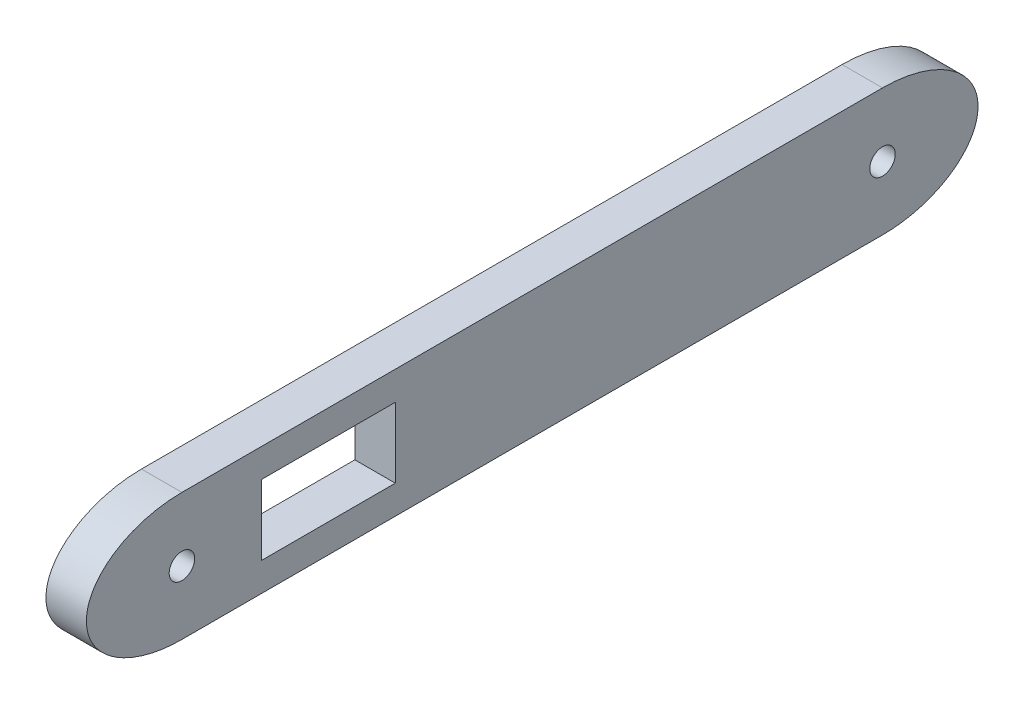
ISO-10303-21;
HEADER;
FILE_DESCRIPTION(('STEP AP214'),'2;1');
FILE_NAME('part.step','',(''),(''),'','','');
FILE_SCHEMA(('AUTOMOTIVE_DESIGN { 1 0 10303 214 1 1 1 1 }'));
ENDSEC;
DATA;
#1=APPLICATION_CONTEXT('core data for automotive mechanical design processes');
#2=APPLICATION_PROTOCOL_DEFINITION('international standard','automotive_design',2000,#1);
#3=PRODUCT_CONTEXT('',#1,'mechanical');
#4=PRODUCT('Part','Part','',(#3));
#5=PRODUCT_RELATED_PRODUCT_CATEGORY('part','',(#4));
#6=PRODUCT_DEFINITION_FORMATION('','',#4);
#7=PRODUCT_DEFINITION_CONTEXT('part definition',#1,'design');
#8=PRODUCT_DEFINITION('design','',#6,#7);
#9=PRODUCT_DEFINITION_SHAPE('','',#8);
#10=(LENGTH_UNIT() NAMED_UNIT(*) SI_UNIT(.MILLI.,.METRE.));
#11=(NAMED_UNIT(*) PLANE_ANGLE_UNIT() SI_UNIT($,.RADIAN.));
#12=(NAMED_UNIT(*) SI_UNIT($,.STERADIAN.) SOLID_ANGLE_UNIT());
#13=UNCERTAINTY_MEASURE_WITH_UNIT(LENGTH_MEASURE(1.E-05),#10,'distance_accuracy_value','');
#14=(GEOMETRIC_REPRESENTATION_CONTEXT(3) GLOBAL_UNCERTAINTY_ASSIGNED_CONTEXT((#13)) GLOBAL_UNIT_ASSIGNED_CONTEXT((#10,
#11,#12)) REPRESENTATION_CONTEXT('',''));
#15=CARTESIAN_POINT('',(0.,0.,0.));
#16=DIRECTION('',(0.,0.,1.));
#17=DIRECTION('',(1.,0.,0.));
#18=AXIS2_PLACEMENT_3D('',#15,#16,#17);
#19=CARTESIAN_POINT('',(12.7,0.,-110.));
#20=DIRECTION('',(-1.,0.,0.));
#21=DIRECTION('',(0.,0.,-1.));
#22=AXIS2_PLACEMENT_3D('',#19,#20,#21);
#23=ELLIPSE('',#22,30.,20.);
#24=DIRECTION('',(-1.,0.,0.));
#25=VECTOR('',#24,1.);
#26=SURFACE_OF_LINEAR_EXTRUSION('',#23,#25);
#27=CARTESIAN_POINT('',(0.,0.,-110.));
#28=DIRECTION('',(-1.,0.,0.));
#29=DIRECTION('',(0.,0.,-1.));
#30=AXIS2_PLACEMENT_3D('',#27,#28,#29);
#31=ELLIPSE('',#30,30.,20.);
#32=CARTESIAN_POINT('',(0.,20.,-110.));
#33=VERTEX_POINT('',#32);
#34=CARTESIAN_POINT('',(0.,-19.9999999999999,-110.));
#35=VERTEX_POINT('',#34);
#36=EDGE_CURVE('E214',#33,#35,#31,.T.);
#37=ORIENTED_EDGE('',*,*,#36,.F.);
#38=DIRECTION('',(-1.,0.,0.));
#39=VECTOR('',#38,1.);
#40=CARTESIAN_POINT('',(12.7,20.,-110.));
#41=LINE('',#40,#39);
#42=CARTESIAN_POINT('',(12.7,20.,-110.));
#43=VERTEX_POINT('',#42);
#44=EDGE_CURVE('E72',#43,#33,#41,.T.);
#45=ORIENTED_EDGE('',*,*,#44,.F.);
#46=CARTESIAN_POINT('',(12.7,-19.9999999999999,-110.));
#47=VERTEX_POINT('',#46);
#48=EDGE_CURVE('E178',#43,#47,#23,.T.);
#49=ORIENTED_EDGE('',*,*,#48,.T.);
#50=DIRECTION('',(-1.,0.,0.));
#51=VECTOR('',#50,1.);
#52=CARTESIAN_POINT('',(12.7,-19.9999999999999,-110.));
#53=LINE('',#52,#51);
#54=EDGE_CURVE('E12',#47,#35,#53,.T.);
#55=ORIENTED_EDGE('',*,*,#54,.T.);
#56=EDGE_LOOP('',(#37,#45,#49,#55));
#57=FACE_BOUND('',#56,.T.);
#58=ADVANCED_FACE('F62',(#57),#26,.T.);
#59=CARTESIAN_POINT('',(12.7,20.,0.));
#60=DIRECTION('',(0.,1.,0.));
#61=DIRECTION('',(0.,0.,1.));
#62=AXIS2_PLACEMENT_3D('',#59,#60,#61);
#63=PLANE('',#62);
#64=DIRECTION('',(0.,0.,-1.));
#65=VECTOR('',#64,1.);
#66=CARTESIAN_POINT('',(0.,20.,0.));
#67=LINE('',#66,#65);
#68=CARTESIAN_POINT('',(0.,20.,110.));
#69=VERTEX_POINT('',#68);
#70=EDGE_CURVE('E179',#69,#33,#67,.T.);
#71=ORIENTED_EDGE('',*,*,#70,.F.);
#72=DIRECTION('',(-1.,0.,0.));
#73=VECTOR('',#72,1.);
#74=CARTESIAN_POINT('',(12.7,20.,110.));
#75=LINE('',#74,#73);
#76=CARTESIAN_POINT('',(12.7,20.,110.));
#77=VERTEX_POINT('',#76);
#78=EDGE_CURVE('E226',#77,#69,#75,.T.);
#79=ORIENTED_EDGE('',*,*,#78,.F.);
#80=DIRECTION('',(0.,0.,-1.));
#81=VECTOR('',#80,1.);
#82=CARTESIAN_POINT('',(12.7,20.,0.));
#83=LINE('',#82,#81);
#84=EDGE_CURVE('E184',#77,#43,#83,.T.);
#85=ORIENTED_EDGE('',*,*,#84,.T.);
#86=ORIENTED_EDGE('',*,*,#44,.T.);
#87=EDGE_LOOP('',(#71,#79,#85,#86));
#88=FACE_BOUND('',#87,.T.);
#89=ADVANCED_FACE('F189',(#88),#63,.T.);
#90=CARTESIAN_POINT('',(12.7,-20.,0.));
#91=DIRECTION('',(0.,1.,0.));
#92=DIRECTION('',(0.,0.,1.));
#93=AXIS2_PLACEMENT_3D('',#90,#91,#92);
#94=PLANE('',#93);
#95=DIRECTION('',(0.,0.,-1.));
#96=VECTOR('',#95,1.);
#97=CARTESIAN_POINT('',(0.,-20.,0.));
#98=LINE('',#97,#96);
#99=CARTESIAN_POINT('',(0.,-20.,110.));
#100=VERTEX_POINT('',#99);
#101=EDGE_CURVE('E206',#100,#35,#98,.T.);
#102=ORIENTED_EDGE('',*,*,#101,.T.);
#103=ORIENTED_EDGE('',*,*,#54,.F.);
#104=DIRECTION('',(0.,0.,-1.));
#105=VECTOR('',#104,1.);
#106=CARTESIAN_POINT('',(12.7,-20.,0.));
#107=LINE('',#106,#105);
#108=CARTESIAN_POINT('',(12.7,-20.,110.));
#109=VERTEX_POINT('',#108);
#110=EDGE_CURVE('E175',#109,#47,#107,.T.);
#111=ORIENTED_EDGE('',*,*,#110,.F.);
#112=DIRECTION('',(-1.,0.,0.));
#113=VECTOR('',#112,1.);
#114=CARTESIAN_POINT('',(12.7,-20.,110.));
#115=LINE('',#114,#113);
#116=EDGE_CURVE('E209',#109,#100,#115,.T.);
#117=ORIENTED_EDGE('',*,*,#116,.T.);
#118=EDGE_LOOP('',(#102,#103,#111,#117));
#119=FACE_BOUND('',#118,.T.);
#120=ADVANCED_FACE('F192',(#119),#94,.F.);
#121=CARTESIAN_POINT('',(0.,0.,0.));
#122=DIRECTION('',(1.,0.,0.));
#123=DIRECTION('',(0.,0.,-1.));
#124=AXIS2_PLACEMENT_3D('',#121,#122,#123);
#125=PLANE('',#124);
#126=CARTESIAN_POINT('',(0.,0.,110.));
#127=DIRECTION('',(1.,0.,0.));
#128=DIRECTION('',(0.,0.,-1.));
#129=AXIS2_PLACEMENT_3D('',#126,#127,#128);
#130=CIRCLE('',#129,4.00000000000001);
#131=CARTESIAN_POINT('',(0.,0.,106.));
#132=VERTEX_POINT('',#131);
#133=EDGE_CURVE('E236',#132,#132,#130,.T.);
#134=ORIENTED_EDGE('',*,*,#133,.T.);
#135=EDGE_LOOP('',(#134));
#136=FACE_BOUND('',#135,.T.);
#137=CARTESIAN_POINT('',(0.,0.,-110.));
#138=DIRECTION('',(1.,0.,0.));
#139=DIRECTION('',(0.,0.,1.));
#140=AXIS2_PLACEMENT_3D('',#137,#138,#139);
#141=CIRCLE('',#140,4.00000000000001);
#142=CARTESIAN_POINT('',(0.,0.,-106.));
#143=VERTEX_POINT('',#142);
#144=EDGE_CURVE('E153',#143,#143,#141,.T.);
#145=ORIENTED_EDGE('',*,*,#144,.T.);
#146=EDGE_LOOP('',(#145));
#147=FACE_BOUND('',#146,.T.);
#148=DIRECTION('',(0.,0.,-1.));
#149=VECTOR('',#148,1.);
#150=CARTESIAN_POINT('',(0.,-11.,85.));
#151=LINE('',#150,#149);
#152=CARTESIAN_POINT('',(0.,-11.,85.));
#153=VERTEX_POINT('',#152);
#154=CARTESIAN_POINT('',(0.,-11.,43.));
#155=VERTEX_POINT('',#154);
#156=EDGE_CURVE('E163',#153,#155,#151,.T.);
#157=ORIENTED_EDGE('',*,*,#156,.T.);
#158=DIRECTION('',(0.,1.,0.));
#159=VECTOR('',#158,1.);
#160=CARTESIAN_POINT('',(0.,11.,43.));
#161=LINE('',#160,#159);
#162=CARTESIAN_POINT('',(0.,11.,43.));
#163=VERTEX_POINT('',#162);
#164=EDGE_CURVE('E131',#155,#163,#161,.T.);
#165=ORIENTED_EDGE('',*,*,#164,.T.);
#166=DIRECTION('',(0.,0.,1.));
#167=VECTOR('',#166,1.);
#168=CARTESIAN_POINT('',(0.,11.,85.));
#169=LINE('',#168,#167);
#170=CARTESIAN_POINT('',(0.,11.,85.));
#171=VERTEX_POINT('',#170);
#172=EDGE_CURVE('E169',#163,#171,#169,.T.);
#173=ORIENTED_EDGE('',*,*,#172,.T.);
#174=DIRECTION('',(0.,-1.,0.));
#175=VECTOR('',#174,1.);
#176=CARTESIAN_POINT('',(0.,11.,85.));
#177=LINE('',#176,#175);
#178=EDGE_CURVE('E80',#171,#153,#177,.T.);
#179=ORIENTED_EDGE('',*,*,#178,.T.);
#180=EDGE_LOOP('',(#157,#165,#173,#179));
#181=FACE_BOUND('',#180,.T.);
#182=ORIENTED_EDGE('',*,*,#101,.F.);
#183=CARTESIAN_POINT('',(0.,0.,110.));
#184=DIRECTION('',(1.,0.,0.));
#185=DIRECTION('',(0.,0.,1.));
#186=AXIS2_PLACEMENT_3D('',#183,#184,#185);
#187=ELLIPSE('',#186,30.,20.);
#188=EDGE_CURVE('E67',#69,#100,#187,.T.);
#189=ORIENTED_EDGE('',*,*,#188,.F.);
#190=ORIENTED_EDGE('',*,*,#70,.T.);
#191=ORIENTED_EDGE('',*,*,#36,.T.);
#192=EDGE_LOOP('',(#182,#189,#190,#191));
#193=FACE_BOUND('',#192,.T.);
#194=ADVANCED_FACE('F194',(#136,#147,#181,#193),#125,.F.);
#195=CARTESIAN_POINT('',(12.7,0.,0.));
#196=DIRECTION('',(1.,0.,0.));
#197=DIRECTION('',(0.,0.,-1.));
#198=AXIS2_PLACEMENT_3D('',#195,#196,#197);
#199=PLANE('',#198);
#200=CARTESIAN_POINT('',(12.7,0.,110.));
#201=DIRECTION('',(1.,0.,0.));
#202=DIRECTION('',(0.,0.,-1.));
#203=AXIS2_PLACEMENT_3D('',#200,#201,#202);
#204=CIRCLE('',#203,4.00000000000001);
#205=CARTESIAN_POINT('',(12.7,0.,106.));
#206=VERTEX_POINT('',#205);
#207=EDGE_CURVE('E240',#206,#206,#204,.T.);
#208=ORIENTED_EDGE('',*,*,#207,.F.);
#209=EDGE_LOOP('',(#208));
#210=FACE_BOUND('',#209,.T.);
#211=CARTESIAN_POINT('',(12.7,0.,-110.));
#212=DIRECTION('',(1.,0.,0.));
#213=DIRECTION('',(0.,0.,1.));
#214=AXIS2_PLACEMENT_3D('',#211,#212,#213);
#215=CIRCLE('',#214,4.00000000000001);
#216=CARTESIAN_POINT('',(12.7,0.,-106.));
#217=VERTEX_POINT('',#216);
#218=EDGE_CURVE('E158',#217,#217,#215,.T.);
#219=ORIENTED_EDGE('',*,*,#218,.F.);
#220=EDGE_LOOP('',(#219));
#221=FACE_BOUND('',#220,.T.);
#222=DIRECTION('',(0.,1.,0.));
#223=VECTOR('',#222,1.);
#224=CARTESIAN_POINT('',(12.7,11.,43.));
#225=LINE('',#224,#223);
#226=CARTESIAN_POINT('',(12.7,-11.,43.));
#227=VERTEX_POINT('',#226);
#228=CARTESIAN_POINT('',(12.7,11.,43.));
#229=VERTEX_POINT('',#228);
#230=EDGE_CURVE('E88',#227,#229,#225,.T.);
#231=ORIENTED_EDGE('',*,*,#230,.F.);
#232=DIRECTION('',(0.,0.,-1.));
#233=VECTOR('',#232,1.);
#234=CARTESIAN_POINT('',(12.7,-11.,85.));
#235=LINE('',#234,#233);
#236=CARTESIAN_POINT('',(12.7,-11.,85.));
#237=VERTEX_POINT('',#236);
#238=EDGE_CURVE('E139',#237,#227,#235,.T.);
#239=ORIENTED_EDGE('',*,*,#238,.F.);
#240=DIRECTION('',(0.,-1.,0.));
#241=VECTOR('',#240,1.);
#242=CARTESIAN_POINT('',(12.7,11.,85.));
#243=LINE('',#242,#241);
#244=CARTESIAN_POINT('',(12.7,11.,85.));
#245=VERTEX_POINT('',#244);
#246=EDGE_CURVE('E145',#245,#237,#243,.T.);
#247=ORIENTED_EDGE('',*,*,#246,.F.);
#248=DIRECTION('',(0.,0.,1.));
#249=VECTOR('',#248,1.);
#250=CARTESIAN_POINT('',(12.7,11.,85.));
#251=LINE('',#250,#249);
#252=EDGE_CURVE('E151',#229,#245,#251,.T.);
#253=ORIENTED_EDGE('',*,*,#252,.F.);
#254=EDGE_LOOP('',(#231,#239,#247,#253));
#255=FACE_BOUND('',#254,.T.);
#256=ORIENTED_EDGE('',*,*,#110,.T.);
#257=ORIENTED_EDGE('',*,*,#48,.F.);
#258=ORIENTED_EDGE('',*,*,#84,.F.);
#259=CARTESIAN_POINT('',(12.7,0.,110.));
#260=DIRECTION('',(1.,0.,0.));
#261=DIRECTION('',(0.,0.,1.));
#262=AXIS2_PLACEMENT_3D('',#259,#260,#261);
#263=ELLIPSE('',#262,30.,20.);
#264=EDGE_CURVE('E215',#77,#109,#263,.T.);
#265=ORIENTED_EDGE('',*,*,#264,.T.);
#266=EDGE_LOOP('',(#256,#257,#258,#265));
#267=FACE_BOUND('',#266,.T.);
#268=ADVANCED_FACE('F148',(#210,#221,#255,#267),#199,.T.);
#269=DIRECTION('',(-1.,0.,0.));
#270=VECTOR('',#269,1.);
#271=SURFACE_OF_LINEAR_EXTRUSION('',#263,#270);
#272=ORIENTED_EDGE('',*,*,#116,.F.);
#273=ORIENTED_EDGE('',*,*,#264,.F.);
#274=ORIENTED_EDGE('',*,*,#78,.T.);
#275=ORIENTED_EDGE('',*,*,#188,.T.);
#276=EDGE_LOOP('',(#272,#273,#274,#275));
#277=FACE_BOUND('',#276,.T.);
#278=ADVANCED_FACE('F64',(#277),#271,.F.);
#279=CARTESIAN_POINT('',(0.,11.,43.));
#280=DIRECTION('',(0.,0.,-1.));
#281=DIRECTION('',(-1.,0.,0.));
#282=AXIS2_PLACEMENT_3D('',#279,#280,#281);
#283=PLANE('',#282);
#284=ORIENTED_EDGE('',*,*,#230,.T.);
#285=DIRECTION('',(1.,0.,0.));
#286=VECTOR('',#285,1.);
#287=CARTESIAN_POINT('',(0.,11.,43.));
#288=LINE('',#287,#286);
#289=EDGE_CURVE('E166',#163,#229,#288,.T.);
#290=ORIENTED_EDGE('',*,*,#289,.F.);
#291=ORIENTED_EDGE('',*,*,#164,.F.);
#292=DIRECTION('',(1.,0.,0.));
#293=VECTOR('',#292,1.);
#294=CARTESIAN_POINT('',(0.,-11.,43.));
#295=LINE('',#294,#293);
#296=EDGE_CURVE('E127',#155,#227,#295,.T.);
#297=ORIENTED_EDGE('',*,*,#296,.T.);
#298=EDGE_LOOP('',(#284,#290,#291,#297));
#299=FACE_BOUND('',#298,.T.);
#300=ADVANCED_FACE('F129',(#299),#283,.F.);
#301=CARTESIAN_POINT('',(0.,-11.,85.));
#302=DIRECTION('',(0.,-1.,0.));
#303=DIRECTION('',(0.,0.,-1.));
#304=AXIS2_PLACEMENT_3D('',#301,#302,#303);
#305=PLANE('',#304);
#306=ORIENTED_EDGE('',*,*,#238,.T.);
#307=ORIENTED_EDGE('',*,*,#296,.F.);
#308=ORIENTED_EDGE('',*,*,#156,.F.);
#309=DIRECTION('',(1.,0.,0.));
#310=VECTOR('',#309,1.);
#311=CARTESIAN_POINT('',(0.,-11.,85.));
#312=LINE('',#311,#310);
#313=EDGE_CURVE('E136',#153,#237,#312,.T.);
#314=ORIENTED_EDGE('',*,*,#313,.T.);
#315=EDGE_LOOP('',(#306,#307,#308,#314));
#316=FACE_BOUND('',#315,.T.);
#317=ADVANCED_FACE('F140',(#316),#305,.F.);
#318=CARTESIAN_POINT('',(0.,11.,85.));
#319=DIRECTION('',(0.,0.,1.));
#320=DIRECTION('',(1.,0.,0.));
#321=AXIS2_PLACEMENT_3D('',#318,#319,#320);
#322=PLANE('',#321);
#323=ORIENTED_EDGE('',*,*,#246,.T.);
#324=ORIENTED_EDGE('',*,*,#313,.F.);
#325=ORIENTED_EDGE('',*,*,#178,.F.);
#326=DIRECTION('',(1.,0.,0.));
#327=VECTOR('',#326,1.);
#328=CARTESIAN_POINT('',(0.,11.,85.));
#329=LINE('',#328,#327);
#330=EDGE_CURVE('E252',#171,#245,#329,.T.);
#331=ORIENTED_EDGE('',*,*,#330,.T.);
#332=EDGE_LOOP('',(#323,#324,#325,#331));
#333=FACE_BOUND('',#332,.T.);
#334=ADVANCED_FACE('F257',(#333),#322,.F.);
#335=CARTESIAN_POINT('',(0.,11.,85.));
#336=DIRECTION('',(0.,1.,0.));
#337=DIRECTION('',(0.,0.,1.));
#338=AXIS2_PLACEMENT_3D('',#335,#336,#337);
#339=PLANE('',#338);
#340=ORIENTED_EDGE('',*,*,#252,.T.);
#341=ORIENTED_EDGE('',*,*,#330,.F.);
#342=ORIENTED_EDGE('',*,*,#172,.F.);
#343=ORIENTED_EDGE('',*,*,#289,.T.);
#344=EDGE_LOOP('',(#340,#341,#342,#343));
#345=FACE_BOUND('',#344,.T.);
#346=ADVANCED_FACE('F260',(#345),#339,.F.);
#347=CARTESIAN_POINT('',(0.,0.,-110.));
#348=DIRECTION('',(1.,0.,0.));
#349=DIRECTION('',(0.,0.,-1.));
#350=AXIS2_PLACEMENT_3D('',#347,#348,#349);
#351=CYLINDRICAL_SURFACE('',#350,4.00000000000001);
#352=ORIENTED_EDGE('',*,*,#144,.F.);
#353=EDGE_LOOP('',(#352));
#354=FACE_BOUND('',#353,.T.);
#355=ORIENTED_EDGE('',*,*,#218,.T.);
#356=EDGE_LOOP('',(#355));
#357=FACE_BOUND('',#356,.T.);
#358=ADVANCED_FACE('F263',(#354,#357),#351,.F.);
#359=CARTESIAN_POINT('',(0.,0.,110.));
#360=DIRECTION('',(1.,0.,0.));
#361=DIRECTION('',(0.,0.,-1.));
#362=AXIS2_PLACEMENT_3D('',#359,#360,#361);
#363=CYLINDRICAL_SURFACE('',#362,4.00000000000001);
#364=ORIENTED_EDGE('',*,*,#133,.F.);
#365=EDGE_LOOP('',(#364));
#366=FACE_BOUND('',#365,.T.);
#367=ORIENTED_EDGE('',*,*,#207,.T.);
#368=EDGE_LOOP('',(#367));
#369=FACE_BOUND('',#368,.T.);
#370=ADVANCED_FACE('F269',(#366,#369),#363,.F.);
#371=CLOSED_SHELL('',(#58,#89,#120,#194,#268,#278,#300,#317,#334,#346,#358,#370));
#372=MANIFOLD_SOLID_BREP('B2',#371);
#373=ADVANCED_BREP_SHAPE_REPRESENTATION('',(#18,#372),#14);
#374=SHAPE_DEFINITION_REPRESENTATION(#9,#373);
ENDSEC;
END-ISO-10303-21;
